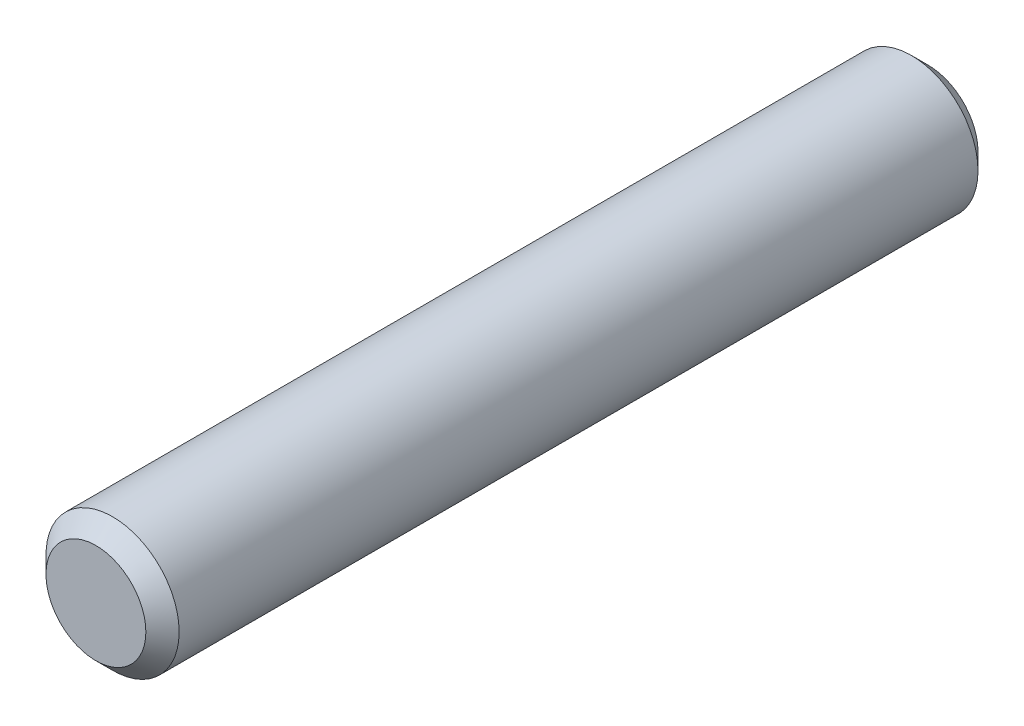
ISO-10303-21;
HEADER;
FILE_DESCRIPTION(('STEP AP214'),'2;1');
FILE_NAME('part.step','',(''),(''),'','','');
FILE_SCHEMA(('AUTOMOTIVE_DESIGN { 1 0 10303 214 1 1 1 1 }'));
ENDSEC;
DATA;
#1=APPLICATION_CONTEXT('core data for automotive mechanical design processes');
#2=APPLICATION_PROTOCOL_DEFINITION('international standard','automotive_design',2000,#1);
#3=PRODUCT_CONTEXT('',#1,'mechanical');
#4=PRODUCT('Part','Part','',(#3));
#5=PRODUCT_RELATED_PRODUCT_CATEGORY('part','',(#4));
#6=PRODUCT_DEFINITION_FORMATION('','',#4);
#7=PRODUCT_DEFINITION_CONTEXT('part definition',#1,'design');
#8=PRODUCT_DEFINITION('design','',#6,#7);
#9=PRODUCT_DEFINITION_SHAPE('','',#8);
#10=(LENGTH_UNIT() NAMED_UNIT(*) SI_UNIT(.MILLI.,.METRE.));
#11=(NAMED_UNIT(*) PLANE_ANGLE_UNIT() SI_UNIT($,.RADIAN.));
#12=(NAMED_UNIT(*) SI_UNIT($,.STERADIAN.) SOLID_ANGLE_UNIT());
#13=UNCERTAINTY_MEASURE_WITH_UNIT(LENGTH_MEASURE(1.E-05),#10,'distance_accuracy_value','');
#14=(GEOMETRIC_REPRESENTATION_CONTEXT(3) GLOBAL_UNCERTAINTY_ASSIGNED_CONTEXT((#13)) GLOBAL_UNIT_ASSIGNED_CONTEXT((#10,
#11,#12)) REPRESENTATION_CONTEXT('',''));
#15=CARTESIAN_POINT('',(0.,0.,0.));
#16=DIRECTION('',(0.,0.,1.));
#17=DIRECTION('',(1.,0.,0.));
#18=AXIS2_PLACEMENT_3D('',#15,#16,#17);
#19=CARTESIAN_POINT('',(0.,0.,50.));
#20=DIRECTION('',(0.,0.,-1.));
#21=DIRECTION('',(-1.,0.,0.));
#22=AXIS2_PLACEMENT_3D('',#19,#20,#21);
#23=CYLINDRICAL_SURFACE('',#22,4.);
#24=CARTESIAN_POINT('',(0.,0.,49.));
#25=DIRECTION('',(0.,0.,1.));
#26=DIRECTION('',(1.,0.,0.));
#27=AXIS2_PLACEMENT_3D('',#24,#25,#26);
#28=CIRCLE('',#27,4.);
#29=CARTESIAN_POINT('',(4.,0.,49.));
#30=VERTEX_POINT('',#29);
#31=EDGE_CURVE('E38',#30,#30,#28,.F.);
#32=ORIENTED_EDGE('',*,*,#31,.T.);
#33=EDGE_LOOP('',(#32));
#34=FACE_BOUND('',#33,.T.);
#35=CARTESIAN_POINT('',(0.,0.,1.));
#36=DIRECTION('',(0.,0.,1.));
#37=DIRECTION('',(1.,0.,0.));
#38=AXIS2_PLACEMENT_3D('',#35,#36,#37);
#39=CIRCLE('',#38,4.);
#40=CARTESIAN_POINT('',(4.,0.,1.));
#41=VERTEX_POINT('',#40);
#42=EDGE_CURVE('E42',#41,#41,#39,.T.);
#43=ORIENTED_EDGE('',*,*,#42,.T.);
#44=EDGE_LOOP('',(#43));
#45=FACE_BOUND('',#44,.T.);
#46=ADVANCED_FACE('F31',(#34,#45),#23,.T.);
#47=CARTESIAN_POINT('',(0.,0.,50.));
#48=DIRECTION('',(0.,0.,1.));
#49=DIRECTION('',(1.,0.,0.));
#50=AXIS2_PLACEMENT_3D('',#47,#48,#49);
#51=PLANE('',#50);
#52=CARTESIAN_POINT('',(0.,0.,50.));
#53=DIRECTION('',(0.,0.,1.));
#54=DIRECTION('',(1.,0.,0.));
#55=AXIS2_PLACEMENT_3D('',#52,#53,#54);
#56=CIRCLE('',#55,3.);
#57=CARTESIAN_POINT('',(3.,0.,50.));
#58=VERTEX_POINT('',#57);
#59=EDGE_CURVE('E46',#58,#58,#56,.T.);
#60=ORIENTED_EDGE('',*,*,#59,.T.);
#61=EDGE_LOOP('',(#60));
#62=FACE_BOUND('',#61,.T.);
#63=ADVANCED_FACE('F52',(#62),#51,.T.);
#64=CARTESIAN_POINT('',(0.,0.,0.));
#65=DIRECTION('',(0.,0.,1.));
#66=DIRECTION('',(1.,0.,0.));
#67=AXIS2_PLACEMENT_3D('',#64,#65,#66);
#68=PLANE('',#67);
#69=CARTESIAN_POINT('',(0.,0.,0.));
#70=DIRECTION('',(0.,0.,1.));
#71=DIRECTION('',(1.,0.,0.));
#72=AXIS2_PLACEMENT_3D('',#69,#70,#71);
#73=CIRCLE('',#72,2.99999999999999);
#74=CARTESIAN_POINT('',(2.99999999999999,0.,0.));
#75=VERTEX_POINT('',#74);
#76=EDGE_CURVE('E10',#75,#75,#73,.F.);
#77=ORIENTED_EDGE('',*,*,#76,.T.);
#78=EDGE_LOOP('',(#77));
#79=FACE_BOUND('',#78,.T.);
#80=ADVANCED_FACE('F56',(#79),#68,.F.);
#81=CARTESIAN_POINT('',(0.,0.,50.));
#82=DIRECTION('',(0.,0.,-1.));
#83=DIRECTION('',(-1.,0.,0.));
#84=AXIS2_PLACEMENT_3D('',#81,#82,#83);
#85=CONICAL_SURFACE('',#84,3.,0.785398163397443);
#86=ORIENTED_EDGE('',*,*,#31,.F.);
#87=EDGE_LOOP('',(#86));
#88=FACE_BOUND('',#87,.T.);
#89=ORIENTED_EDGE('',*,*,#59,.F.);
#90=EDGE_LOOP('',(#89));
#91=FACE_BOUND('',#90,.T.);
#92=ADVANCED_FACE('F54',(#88,#91),#85,.T.);
#93=CARTESIAN_POINT('',(0.,0.,1.));
#94=DIRECTION('',(0.,0.,1.));
#95=DIRECTION('',(1.,0.,0.));
#96=AXIS2_PLACEMENT_3D('',#93,#94,#95);
#97=CONICAL_SURFACE('',#96,4.,0.785398163397454);
#98=ORIENTED_EDGE('',*,*,#76,.F.);
#99=EDGE_LOOP('',(#98));
#100=FACE_BOUND('',#99,.T.);
#101=ORIENTED_EDGE('',*,*,#42,.F.);
#102=EDGE_LOOP('',(#101));
#103=FACE_BOUND('',#102,.T.);
#104=ADVANCED_FACE('F33',(#100,#103),#97,.T.);
#105=CLOSED_SHELL('',(#46,#63,#80,#92,#104));
#106=MANIFOLD_SOLID_BREP('B2',#105);
#107=ADVANCED_BREP_SHAPE_REPRESENTATION('',(#18,#106),#14);
#108=SHAPE_DEFINITION_REPRESENTATION(#9,#107);
ENDSEC;
END-ISO-10303-21;
